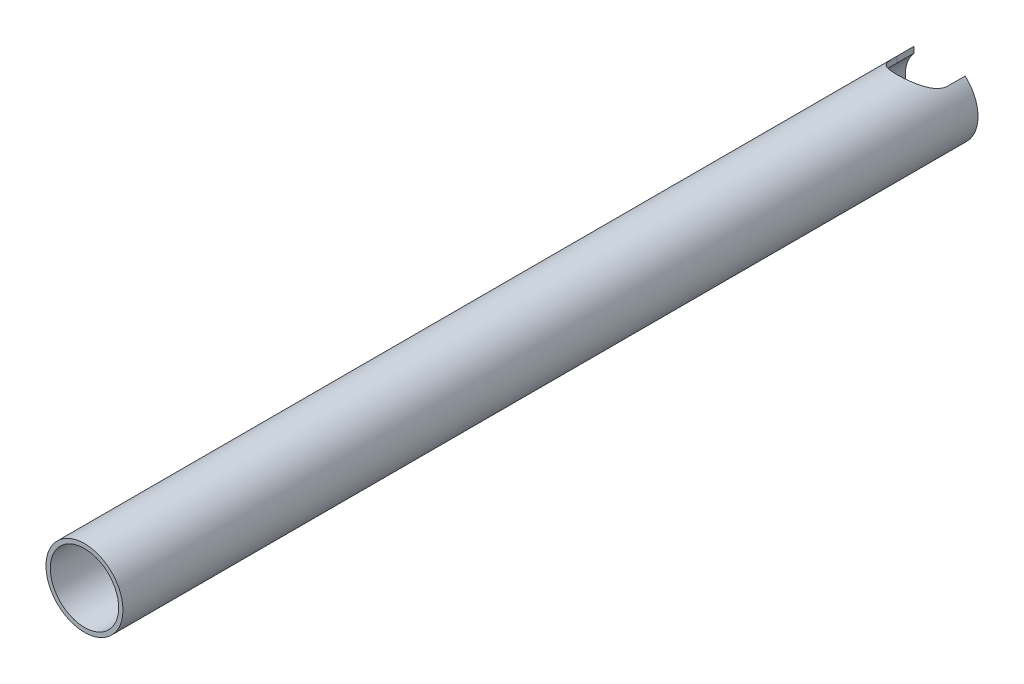
ISO-10303-21;
HEADER;
FILE_DESCRIPTION(('STEP AP214'),'2;1');
FILE_NAME('part.step','',(''),(''),'','','');
FILE_SCHEMA(('AUTOMOTIVE_DESIGN { 1 0 10303 214 1 1 1 1 }'));
ENDSEC;
DATA;
#1=APPLICATION_CONTEXT('core data for automotive mechanical design processes');
#2=APPLICATION_PROTOCOL_DEFINITION('international standard','automotive_design',2000,#1);
#3=PRODUCT_CONTEXT('',#1,'mechanical');
#4=PRODUCT('Part','Part','',(#3));
#5=PRODUCT_RELATED_PRODUCT_CATEGORY('part','',(#4));
#6=PRODUCT_DEFINITION_FORMATION('','',#4);
#7=PRODUCT_DEFINITION_CONTEXT('part definition',#1,'design');
#8=PRODUCT_DEFINITION('design','',#6,#7);
#9=PRODUCT_DEFINITION_SHAPE('','',#8);
#10=(LENGTH_UNIT() NAMED_UNIT(*) SI_UNIT(.MILLI.,.METRE.));
#11=(NAMED_UNIT(*) PLANE_ANGLE_UNIT() SI_UNIT($,.RADIAN.));
#12=(NAMED_UNIT(*) SI_UNIT($,.STERADIAN.) SOLID_ANGLE_UNIT());
#13=UNCERTAINTY_MEASURE_WITH_UNIT(LENGTH_MEASURE(1.E-05),#10,'distance_accuracy_value','');
#14=(GEOMETRIC_REPRESENTATION_CONTEXT(3) GLOBAL_UNCERTAINTY_ASSIGNED_CONTEXT((#13)) GLOBAL_UNIT_ASSIGNED_CONTEXT((#10,
#11,#12)) REPRESENTATION_CONTEXT('',''));
#15=CARTESIAN_POINT('',(0.,0.,0.));
#16=DIRECTION('',(0.,0.,1.));
#17=DIRECTION('',(1.,0.,0.));
#18=AXIS2_PLACEMENT_3D('',#15,#16,#17);
#19=CARTESIAN_POINT('',(0.,0.,-200.));
#20=DIRECTION('',(0.,0.,-1.));
#21=DIRECTION('',(1.,0.,0.));
#22=AXIS2_PLACEMENT_3D('',#19,#20,#21);
#23=PLANE('',#22);
#24=DIRECTION('',(0.,-1.,0.));
#25=VECTOR('',#24,1.);
#26=CARTESIAN_POINT('',(-6.,0.,-200.));
#27=LINE('',#26,#25);
#28=CARTESIAN_POINT('',(-6.,6.70820393249937,-200.));
#29=VERTEX_POINT('',#28);
#30=CARTESIAN_POINT('',(-6.,5.29150262212918,-200.));
#31=VERTEX_POINT('',#30);
#32=EDGE_CURVE('E106',#29,#31,#27,.T.);
#33=ORIENTED_EDGE('',*,*,#32,.T.);
#34=CARTESIAN_POINT('',(0.,0.,-200.));
#35=DIRECTION('',(0.,0.,1.));
#36=DIRECTION('',(1.,0.,0.));
#37=AXIS2_PLACEMENT_3D('',#34,#35,#36);
#38=CIRCLE('',#37,8.);
#39=CARTESIAN_POINT('',(6.,5.29150262212918,-200.));
#40=VERTEX_POINT('',#39);
#41=EDGE_CURVE('E165',#31,#40,#38,.T.);
#42=ORIENTED_EDGE('',*,*,#41,.T.);
#43=DIRECTION('',(0.,1.,0.));
#44=VECTOR('',#43,1.);
#45=CARTESIAN_POINT('',(6.,0.,-200.));
#46=LINE('',#45,#44);
#47=CARTESIAN_POINT('',(6.,6.70820393249937,-200.));
#48=VERTEX_POINT('',#47);
#49=EDGE_CURVE('E118',#40,#48,#46,.T.);
#50=ORIENTED_EDGE('',*,*,#49,.T.);
#51=CARTESIAN_POINT('',(0.,0.,-200.));
#52=DIRECTION('',(0.,0.,1.));
#53=DIRECTION('',(1.,0.,0.));
#54=AXIS2_PLACEMENT_3D('',#51,#52,#53);
#55=CIRCLE('',#54,9.);
#56=EDGE_CURVE('E111',#29,#48,#55,.T.);
#57=ORIENTED_EDGE('',*,*,#56,.F.);
#58=EDGE_LOOP('',(#33,#42,#50,#57));
#59=FACE_BOUND('',#58,.T.);
#60=ADVANCED_FACE('F43',(#59),#23,.T.);
#61=CARTESIAN_POINT('',(0.,0.,0.));
#62=DIRECTION('',(0.,0.,-1.));
#63=DIRECTION('',(1.,0.,0.));
#64=AXIS2_PLACEMENT_3D('',#61,#62,#63);
#65=PLANE('',#64);
#66=CARTESIAN_POINT('',(0.,0.,0.));
#67=DIRECTION('',(0.,0.,1.));
#68=DIRECTION('',(1.,0.,0.));
#69=AXIS2_PLACEMENT_3D('',#66,#67,#68);
#70=CIRCLE('',#69,9.);
#71=CARTESIAN_POINT('',(9.,0.,0.));
#72=VERTEX_POINT('',#71);
#73=EDGE_CURVE('E156',#72,#72,#70,.T.);
#74=ORIENTED_EDGE('',*,*,#73,.T.);
#75=EDGE_LOOP('',(#74));
#76=FACE_BOUND('',#75,.T.);
#77=CARTESIAN_POINT('',(0.,0.,0.));
#78=DIRECTION('',(0.,0.,1.));
#79=DIRECTION('',(1.,0.,0.));
#80=AXIS2_PLACEMENT_3D('',#77,#78,#79);
#81=CIRCLE('',#80,8.);
#82=CARTESIAN_POINT('',(8.,0.,0.));
#83=VERTEX_POINT('',#82);
#84=EDGE_CURVE('E163',#83,#83,#81,.T.);
#85=ORIENTED_EDGE('',*,*,#84,.F.);
#86=EDGE_LOOP('',(#85));
#87=FACE_BOUND('',#86,.T.);
#88=ADVANCED_FACE('F149',(#76,#87),#65,.F.);
#89=CARTESIAN_POINT('',(0.,0.,-200.));
#90=DIRECTION('',(0.,0.,1.));
#91=DIRECTION('',(-1.,0.,0.));
#92=AXIS2_PLACEMENT_3D('',#89,#90,#91);
#93=CYLINDRICAL_SURFACE('',#92,9.);
#94=ORIENTED_EDGE('',*,*,#56,.T.);
#95=DIRECTION('',(0.,0.,1.));
#96=VECTOR('',#95,1.);
#97=CARTESIAN_POINT('',(6.,6.70820393249937,-200.));
#98=LINE('',#97,#96);
#99=CARTESIAN_POINT('',(6.,6.70820393249937,-196.));
#100=VERTEX_POINT('',#99);
#101=EDGE_CURVE('E105',#100,#48,#98,.F.);
#102=ORIENTED_EDGE('',*,*,#101,.F.);
#103=CARTESIAN_POINT('',(-6.,6.70820393249937,-196.));
#104=CARTESIAN_POINT('',(-6.0000393183433,6.70812194573574,-195.852506980731));
#105=CARTESIAN_POINT('',(-5.99456347786238,6.71306593091113,-195.705061652411));
#106=CARTESIAN_POINT('',(-5.97289327726244,6.73237859024483,-195.411774037341));
#107=CARTESIAN_POINT('',(-5.95671328084198,6.74673463431257,-195.265929868277));
#108=CARTESIAN_POINT('',(-5.91415607609064,6.78406215747855,-194.978375981598));
#109=CARTESIAN_POINT('',(-5.88788106748825,6.8069472231382,-194.836639667377));
#110=CARTESIAN_POINT('',(-5.82560066996816,6.86032556958915,-194.556763780513));
#111=CARTESIAN_POINT('',(-5.78959245078331,6.89082106317695,-194.418625266884));
#112=CARTESIAN_POINT('',(-5.70858199668009,6.95807725230193,-194.147428771933));
#113=CARTESIAN_POINT('',(-5.66362787449207,6.994804284088,-194.014347963361));
#114=CARTESIAN_POINT('',(-5.56512538409717,7.07342589112545,-193.753028706149));
#115=CARTESIAN_POINT('',(-5.51157745308584,7.11532020347504,-193.624790011584));
#116=CARTESIAN_POINT('',(-5.33842689493356,7.24722356567827,-193.247177913208));
#117=CARTESIAN_POINT('',(-5.20649519991548,7.34329866853642,-193.005493595962));
#118=CARTESIAN_POINT('',(-4.88998497472128,7.55844009542074,-192.508915856898));
#119=CARTESIAN_POINT('',(-4.70042231706135,7.67876554502885,-192.257747766865));
#120=CARTESIAN_POINT('',(-4.38847297427156,7.85848610554915,-191.905379210826));
#121=CARTESIAN_POINT('',(-4.27982876675124,7.91829423228407,-191.791937198901));
#122=CARTESIAN_POINT('',(-4.05351803224065,8.03649599254022,-191.573519899));
#123=CARTESIAN_POINT('',(-3.93584941894303,8.09488929484438,-191.468546580438));
#124=CARTESIAN_POINT('',(-3.67410276883844,8.21734571815794,-191.25302928572));
#125=CARTESIAN_POINT('',(-3.52867128211092,8.28100042701004,-191.143890846029));
#126=CARTESIAN_POINT('',(-3.22705781179329,8.40312749208883,-190.938441866567));
#127=CARTESIAN_POINT('',(-3.07088087836644,8.46160225363382,-190.842125362347));
#128=CARTESIAN_POINT('',(-2.7485550368627,8.57172289580967,-190.663392008808));
#129=CARTESIAN_POINT('',(-2.58241066290611,8.62337184771766,-190.580968903514));
#130=CARTESIAN_POINT('',(-2.24117837103793,8.71828288420858,-190.431174670396));
#131=CARTESIAN_POINT('',(-2.06609237981828,8.76154676600818,-190.363800316619));
#132=CARTESIAN_POINT('',(-1.72849691899763,8.83395011628131,-190.251932590202));
#133=CARTESIAN_POINT('',(-1.56677951763714,8.8641295404735,-190.205720420075));
#134=CARTESIAN_POINT('',(-1.23871765597762,8.91589255205311,-190.126838317575));
#135=CARTESIAN_POINT('',(-1.0723735087317,8.93747671950317,-190.094167471343));
#136=CARTESIAN_POINT('',(-0.736763503715932,8.97137649057705,-190.042990402912));
#137=CARTESIAN_POINT('',(-0.567500918238733,8.98370186187713,-190.024469252972));
#138=CARTESIAN_POINT('',(-0.227596501670302,8.99872901097531,-190.001900549956));
#139=CARTESIAN_POINT('',(-0.056954868589227,9.00143214661064,-189.997850954732));
#140=CARTESIAN_POINT('',(0.257909828093748,8.99746462243315,-190.003803864367));
#141=CARTESIAN_POINT('',(0.40219455835203,8.99216016134809,-190.01175826242));
#142=CARTESIAN_POINT('',(0.689453317178941,8.97470670280735,-190.037998856573));
#143=CARTESIAN_POINT('',(0.832426917904149,8.96255554664857,-190.056288311231));
#144=CARTESIAN_POINT('',(1.11594062243916,8.93168553622766,-190.102940433048));
#145=CARTESIAN_POINT('',(1.25648156409055,8.91296899238517,-190.131299556643));
#146=CARTESIAN_POINT('',(1.53431926186213,8.86936580246273,-190.197735155283));
#147=CARTESIAN_POINT('',(1.67161473732113,8.84447676380638,-190.235815398588));
#148=CARTESIAN_POINT('',(1.94151594437167,8.78916401420626,-190.321051852994));
#149=CARTESIAN_POINT('',(2.07413974717568,8.75876529383256,-190.368167137181));
#150=CARTESIAN_POINT('',(2.33470201598792,8.69294276948524,-190.471092998353));
#151=CARTESIAN_POINT('',(2.46263881729357,8.65751720146291,-190.526906628487));
#152=CARTESIAN_POINT('',(2.83849835595443,8.5446597697204,-190.706612161669));
#153=CARTESIAN_POINT('',(3.07866953915028,8.46060488844629,-190.842832550333));
#154=CARTESIAN_POINT('',(3.56489228702402,8.26853604776286,-191.1639488568));
#155=CARTESIAN_POINT('',(3.80756841028923,8.15882511006946,-191.35288906415));
#156=CARTESIAN_POINT('',(4.25998331649615,7.93199864466213,-191.763721415403));
#157=CARTESIAN_POINT('',(4.46967121585829,7.81487206125219,-191.985663457895));
#158=CARTESIAN_POINT('',(4.77234020904544,7.63161953706803,-192.359155696051));
#159=CARTESIAN_POINT('',(4.8772295945531,7.56482963236636,-192.500887078842));
#160=CARTESIAN_POINT('',(5.07463232509068,7.43385178781524,-192.793857940915));
#161=CARTESIAN_POINT('',(5.16714277588728,7.36966445889255,-192.945099631629));
#162=CARTESIAN_POINT('',(5.424891961227,7.18436432971937,-193.412196144449));
#163=CARTESIAN_POINT('',(5.57088509041259,7.07017210785883,-193.742080318463));
#164=CARTESIAN_POINT('',(5.77061895485414,6.90737596649755,-194.336081892814));
#165=CARTESIAN_POINT('',(5.83874387569329,6.84936009029308,-194.592758129275));
#166=CARTESIAN_POINT('',(5.91517353662353,6.78319958018771,-194.985829861502));
#167=CARTESIAN_POINT('',(5.93634841066102,6.76463184262495,-195.118054286599));
#168=CARTESIAN_POINT('',(5.96984487292608,6.73509265405631,-195.384427253078));
#169=CARTESIAN_POINT('',(5.98217199357155,6.7241164562877,-195.518574538489));
#170=CARTESIAN_POINT('',(5.99330844907521,6.71418405629563,-195.71085756892));
#171=CARTESIAN_POINT('',(5.99581719087049,6.71194322091241,-195.768644375282));
#172=CARTESIAN_POINT('',(5.99916266713708,6.70895310557702,-195.884284727289));
#173=CARTESIAN_POINT('',(5.99999998296912,6.708203307008,-195.942138242723));
#174=CARTESIAN_POINT('',(6.,6.70820393249937,-196.));
#175=B_SPLINE_CURVE_WITH_KNOTS('',3,(#103,#104,#105,#106,#107,#108,#109,#110,#111,#112,#113,
#114,#115,#116,#117,#118,#119,#120,#121,#122,#123,#124,#125,#126,#127,#128,#129,#130,#131,#132,
#133,#134,#135,#136,#137,#138,#139,#140,#141,#142,#143,#144,#145,#146,#147,#148,#149,#150,#151,
#152,#153,#154,#155,#156,#157,#158,#159,#160,#161,#162,#163,#164,#165,#166,#167,#168,#169,#170,
#171,#172,#173,#174),.UNSPECIFIED.,.F.,.F.,(4,2,2,2,2,2,2,2,2,2,2,2,2,2,2,2,2,2,2,2,2,2,2,2,2,2,
2,2,2,2,2,2,2,2,2,4),(0.,0.442218902060999,0.883845599550486,1.32111440562802,1.75851049975334,
2.19361485357492,2.62869707920835,3.50073479655623,4.50746081603578,5.01131940006734,
5.5152948218338,6.09247253881144,6.66938082173012,7.2460286341691,7.82255271359904,
8.33441185130012,8.84623643963211,9.35752031133303,9.86873203059137,10.3020102889807,
10.7354252327199,11.1686878065584,11.6021185844215,12.0336305045627,12.4652942294365,
13.3279876664779,14.3040591784731,15.2816218010343,15.8466542882344,16.411818651815,
17.5394361699494,18.3513876988232,18.7565175336659,19.1613938233755,19.3350122681653,
19.5085703139019),.UNSPECIFIED.);
#176=CARTESIAN_POINT('',(-6.,6.70820393249937,-196.));
#177=VERTEX_POINT('',#176);
#178=EDGE_CURVE('E109',#177,#100,#175,.T.);
#179=ORIENTED_EDGE('',*,*,#178,.F.);
#180=DIRECTION('',(0.,0.,1.));
#181=VECTOR('',#180,1.);
#182=CARTESIAN_POINT('',(-6.,6.70820393249937,-200.));
#183=LINE('',#182,#181);
#184=EDGE_CURVE('E75',#29,#177,#183,.T.);
#185=ORIENTED_EDGE('',*,*,#184,.F.);
#186=EDGE_LOOP('',(#94,#102,#179,#185));
#187=FACE_BOUND('',#186,.T.);
#188=ORIENTED_EDGE('',*,*,#73,.F.);
#189=EDGE_LOOP('',(#188));
#190=FACE_BOUND('',#189,.T.);
#191=ADVANCED_FACE('F44',(#187,#190),#93,.T.);
#192=CARTESIAN_POINT('',(0.,0.,-200.));
#193=DIRECTION('',(0.,0.,1.));
#194=DIRECTION('',(-1.,0.,0.));
#195=AXIS2_PLACEMENT_3D('',#192,#193,#194);
#196=CYLINDRICAL_SURFACE('',#195,8.);
#197=DIRECTION('',(0.,0.,1.));
#198=VECTOR('',#197,1.);
#199=CARTESIAN_POINT('',(-6.,5.29150262212918,-200.));
#200=LINE('',#199,#198);
#201=CARTESIAN_POINT('',(-6.,5.29150262212918,-196.));
#202=VERTEX_POINT('',#201);
#203=EDGE_CURVE('E11',#31,#202,#200,.T.);
#204=ORIENTED_EDGE('',*,*,#203,.T.);
#205=CARTESIAN_POINT('',(-6.,5.29150262212918,-196.));
#206=CARTESIAN_POINT('',(-6.00000164734553,5.29149746130063,-195.929299215689));
#207=CARTESIAN_POINT('',(-5.99874992483121,5.29292042134915,-195.858612431604));
#208=CARTESIAN_POINT('',(-5.99375929848811,5.29857251101417,-195.717450627859));
#209=CARTESIAN_POINT('',(-5.99002081044604,5.30280117151782,-195.646975574775));
#210=CARTESIAN_POINT('',(-5.97512726223536,5.31959499598561,-195.436438424863));
#211=CARTESIAN_POINT('',(-5.96029391667244,5.33626847732026,-195.296930503187));
#212=CARTESIAN_POINT('',(-5.92146467708413,5.37931891935372,-195.02264831947));
#213=CARTESIAN_POINT('',(-5.89758872729309,5.40556869603609,-194.887836295229));
#214=CARTESIAN_POINT('',(-5.84118213277231,5.46647153069185,-194.621931044734));
#215=CARTESIAN_POINT('',(-5.80864733570754,5.50112861966951,-194.49083963616));
#216=CARTESIAN_POINT('',(-5.73578091551817,5.57705609976159,-194.234076022853));
#217=CARTESIAN_POINT('',(-5.69551468906141,5.61827055638512,-194.108368480834));
#218=CARTESIAN_POINT('',(-5.60752977965139,5.70609193113432,-193.861596067816));
#219=CARTESIAN_POINT('',(-5.55981184109297,5.7526983105091,-193.740530734582));
#220=CARTESIAN_POINT('',(-5.40571853410941,5.89900121175978,-193.383599325024));
#221=CARTESIAN_POINT('',(-5.28863395224688,6.00493049059014,-193.154793376452));
#222=CARTESIAN_POINT('',(-5.08003235744934,6.18093054783945,-192.803606798809));
#223=CARTESIAN_POINT('',(-4.99673902321449,6.24859868310512,-192.674948483868));
#224=CARTESIAN_POINT('',(-4.82093036772026,6.38521973153118,-192.424807481964));
#225=CARTESIAN_POINT('',(-4.72841432126793,6.45417274537597,-192.303325360472));
#226=CARTESIAN_POINT('',(-4.43720798879207,6.66090963382174,-191.949759541453));
#227=CARTESIAN_POINT('',(-4.22484445848777,6.79858453976931,-191.728531124821));
#228=CARTESIAN_POINT('',(-3.85677854448346,7.01077089521444,-191.400035472149));
#229=CARTESIAN_POINT('',(-3.71206447027489,7.08865432832994,-191.282400060903));
#230=CARTESIAN_POINT('',(-3.41024785229984,7.23868552108811,-191.05982239082));
#231=CARTESIAN_POINT('',(-3.25314252757324,7.31083198584902,-190.954882994809));
#232=CARTESIAN_POINT('',(-2.92748738140682,7.44721036286365,-190.759213349274));
#233=CARTESIAN_POINT('',(-2.75895787294117,7.5114557793649,-190.668458781422));
#234=CARTESIAN_POINT('',(-2.41119946943849,7.6301911953997,-190.502438157635));
#235=CARTESIAN_POINT('',(-2.2319763013099,7.68468635517768,-190.427163905697));
#236=CARTESIAN_POINT('',(-1.91981544570525,7.76736517405681,-190.313791142147));
#237=CARTESIAN_POINT('',(-1.78923137620704,7.79852622386618,-190.271328994596));
#238=CARTESIAN_POINT('',(-1.52422909700309,7.85461977621466,-190.195198861307));
#239=CARTESIAN_POINT('',(-1.3898118140051,7.87955377020367,-190.161528769686));
#240=CARTESIAN_POINT('',(-1.1180230429965,7.92268544907432,-190.103448250311));
#241=CARTESIAN_POINT('',(-0.980653655025508,7.94088776510486,-190.079031456338));
#242=CARTESIAN_POINT('',(-0.703792112495761,7.9701977558813,-190.03977994756));
#243=CARTESIAN_POINT('',(-0.564299882018418,7.9813051762812,-190.024945576277));
#244=CARTESIAN_POINT('',(-0.283857320899895,7.99619868039414,-190.005065723171));
#245=CARTESIAN_POINT('',(-0.142904119696008,7.99996542591576,-190.000046097089));
#246=CARTESIAN_POINT('',(0.139006716824936,8.00003409940456,-189.999954535817));
#247=CARTESIAN_POINT('',(0.279964352122297,7.99633605683647,-190.004882561363));
#248=CARTESIAN_POINT('',(0.56082213053902,7.98155736180775,-190.024608757108));
#249=CARTESIAN_POINT('',(0.700722059237648,7.97047525097633,-190.03940887707));
#250=CARTESIAN_POINT('',(0.978397724164498,7.94117321022885,-190.07864865745));
#251=CARTESIAN_POINT('',(1.11617347450189,7.92295332774438,-190.103088253812));
#252=CARTESIAN_POINT('',(1.3839551510545,7.88050768014737,-190.160243554479));
#253=CARTESIAN_POINT('',(1.51406502760778,7.85651130758527,-190.192643953359));
#254=CARTESIAN_POINT('',(1.77072992844799,7.8026752011739,-190.265687098327));
#255=CARTESIAN_POINT('',(1.89728371438224,7.7728334599092,-190.306332676143));
#256=CARTESIAN_POINT('',(2.27058720904833,7.67531280863459,-190.439948434221));
#257=CARTESIAN_POINT('',(2.51116863882605,7.59960732816932,-190.544638930134));
#258=CARTESIAN_POINT('',(2.9969153602917,7.42243473030987,-190.794130794891));
#259=CARTESIAN_POINT('',(3.23975440607125,7.31906538668208,-190.942048607236));
#260=CARTESIAN_POINT('',(3.69829736350047,7.09840449015697,-191.266963816457));
#261=CARTESIAN_POINT('',(3.91398034333128,6.98110233158908,-191.443983405509));
#262=CARTESIAN_POINT('',(4.23583596963117,6.78804083470792,-191.747338267198));
#263=CARTESIAN_POINT('',(4.35122114890484,6.71450091073725,-191.865505604413));
#264=CARTESIAN_POINT('',(4.57160313183084,6.56643304982319,-192.110579711394));
#265=CARTESIAN_POINT('',(4.67660176414746,6.49190528942867,-192.237484936064));
#266=CARTESIAN_POINT('',(4.87611364252768,6.34342206895683,-192.499896498755));
#267=CARTESIAN_POINT('',(4.97061341127991,6.26946745530601,-192.635413548974));
#268=CARTESIAN_POINT('',(5.14865041086736,6.12409941254336,-192.914741514764));
#269=CARTESIAN_POINT('',(5.23219013690457,6.05268540773531,-193.058550531787));
#270=CARTESIAN_POINT('',(5.37254365577724,5.92813404110711,-193.325338733702));
#271=CARTESIAN_POINT('',(5.43138438442486,5.87416125485588,-193.446863733178));
#272=CARTESIAN_POINT('',(5.5413408736172,5.77055000888551,-193.695225150725));
#273=CARTESIAN_POINT('',(5.59245427231992,5.72091287629918,-193.822063177644));
#274=CARTESIAN_POINT('',(5.68625012211941,5.62769176245618,-194.08027559041));
#275=CARTESIAN_POINT('',(5.72896954127146,5.58408150227078,-194.211626948687));
#276=CARTESIAN_POINT('',(5.80567365362211,5.5042910727892,-194.478991477923));
#277=CARTESIAN_POINT('',(5.83966483280454,5.46810539030669,-194.615001101627));
#278=CARTESIAN_POINT('',(5.89031205286352,5.41342854550062,-194.853374139022));
#279=CARTESIAN_POINT('',(5.90916723672386,5.39280369759212,-194.954785604311));
#280=CARTESIAN_POINT('',(5.94171986779775,5.35691605972682,-195.159352566744));
#281=CARTESIAN_POINT('',(5.95541890485186,5.34165161704606,-195.262507516037));
#282=CARTESIAN_POINT('',(5.97755949694622,5.31686736002835,-195.470990602493));
#283=CARTESIAN_POINT('',(5.98595443847325,5.30739850056437,-195.57632982725));
#284=CARTESIAN_POINT('',(5.99718514551604,5.29469401011652,-195.787772528299));
#285=CARTESIAN_POINT('',(6.00001580245987,5.2914641071683,-195.893876617216));
#286=CARTESIAN_POINT('',(6.,5.29150262212919,-196.));
#287=B_SPLINE_CURVE_WITH_KNOTS('',3,(#205,#206,#207,#208,#209,#210,#211,#212,#213,#214,#215,
#216,#217,#218,#219,#220,#221,#222,#223,#224,#225,#226,#227,#228,#229,#230,#231,#232,#233,#234,
#235,#236,#237,#238,#239,#240,#241,#242,#243,#244,#245,#246,#247,#248,#249,#250,#251,#252,#253,
#254,#255,#256,#257,#258,#259,#260,#261,#262,#263,#264,#265,#266,#267,#268,#269,#270,#271,#272,
#273,#274,#275,#276,#277,#278,#279,#280,#281,#282,#283,#284,#285,#286),.UNSPECIFIED.,.F.,.F.,(4,
2,2,2,2,2,2,2,2,2,2,2,2,2,2,2,2,2,2,2,2,2,2,2,2,2,2,2,2,2,2,2,2,2,2,2,2,2,2,2,4),(0.,
0.212049935582529,0.42406442536758,0.847096983047166,1.26470438079724,1.68251240342031,
2.09693077200734,2.51130776838553,3.34263552478065,3.84490978127099,4.34722356338937,
5.35175523229734,5.957376761797,6.56313459941825,7.16784226315849,7.7722289374483,
8.19422783459786,8.61612556112341,9.03773249507414,9.45935454242826,9.88208581267284,
10.3048154143323,10.7276285308357,11.1504388377281,11.5586328901709,11.9669673710899,
12.7830530944666,13.6875367840661,14.5927134337423,15.1346425174526,15.6764760182129,
16.2189972201063,16.7613946945816,17.1972953536469,17.6333289766275,18.0673969560296,
18.5011414384825,18.8164661754747,19.1316936057844,19.4496541383768,19.7679064545729),.UNSPECIFIED.);
#288=CARTESIAN_POINT('',(6.,5.29150262212918,-196.));
#289=VERTEX_POINT('',#288);
#290=EDGE_CURVE('E52',#202,#289,#287,.T.);
#291=ORIENTED_EDGE('',*,*,#290,.T.);
#292=DIRECTION('',(0.,0.,1.));
#293=VECTOR('',#292,1.);
#294=CARTESIAN_POINT('',(6.,5.29150262212918,-200.));
#295=LINE('',#294,#293);
#296=EDGE_CURVE('E104',#289,#40,#295,.F.);
#297=ORIENTED_EDGE('',*,*,#296,.T.);
#298=ORIENTED_EDGE('',*,*,#41,.F.);
#299=EDGE_LOOP('',(#204,#291,#297,#298));
#300=FACE_BOUND('',#299,.T.);
#301=ORIENTED_EDGE('',*,*,#84,.T.);
#302=EDGE_LOOP('',(#301));
#303=FACE_BOUND('',#302,.T.);
#304=ADVANCED_FACE('F145',(#300,#303),#196,.F.);
#305=CARTESIAN_POINT('',(-6.,0.,-204.));
#306=DIRECTION('',(-1.,0.,0.));
#307=DIRECTION('',(0.,0.,-1.));
#308=AXIS2_PLACEMENT_3D('',#305,#306,#307);
#309=PLANE('',#308);
#310=ORIENTED_EDGE('',*,*,#32,.F.);
#311=ORIENTED_EDGE('',*,*,#184,.T.);
#312=DIRECTION('',(0.,1.,0.));
#313=VECTOR('',#312,1.);
#314=CARTESIAN_POINT('',(-6.,0.,-196.));
#315=LINE('',#314,#313);
#316=EDGE_CURVE('E103',#202,#177,#315,.T.);
#317=ORIENTED_EDGE('',*,*,#316,.F.);
#318=ORIENTED_EDGE('',*,*,#203,.F.);
#319=EDGE_LOOP('',(#310,#311,#317,#318));
#320=FACE_BOUND('',#319,.T.);
#321=ADVANCED_FACE('F135',(#320),#309,.F.);
#322=CARTESIAN_POINT('',(0.,0.,-196.));
#323=DIRECTION('',(0.,1.,0.));
#324=DIRECTION('',(0.,0.,-1.));
#325=AXIS2_PLACEMENT_3D('',#322,#323,#324);
#326=CYLINDRICAL_SURFACE('',#325,6.);
#327=ORIENTED_EDGE('',*,*,#316,.T.);
#328=ORIENTED_EDGE('',*,*,#178,.T.);
#329=DIRECTION('',(0.,1.,0.));
#330=VECTOR('',#329,1.);
#331=CARTESIAN_POINT('',(6.,0.,-196.));
#332=LINE('',#331,#330);
#333=EDGE_CURVE('E65',#289,#100,#332,.T.);
#334=ORIENTED_EDGE('',*,*,#333,.F.);
#335=ORIENTED_EDGE('',*,*,#290,.F.);
#336=EDGE_LOOP('',(#327,#328,#334,#335));
#337=FACE_BOUND('',#336,.T.);
#338=ADVANCED_FACE('F107',(#337),#326,.F.);
#339=CARTESIAN_POINT('',(6.,0.,-204.));
#340=DIRECTION('',(1.,0.,0.));
#341=DIRECTION('',(0.,0.,1.));
#342=AXIS2_PLACEMENT_3D('',#339,#340,#341);
#343=PLANE('',#342);
#344=ORIENTED_EDGE('',*,*,#333,.T.);
#345=ORIENTED_EDGE('',*,*,#101,.T.);
#346=ORIENTED_EDGE('',*,*,#49,.F.);
#347=ORIENTED_EDGE('',*,*,#296,.F.);
#348=EDGE_LOOP('',(#344,#345,#346,#347));
#349=FACE_BOUND('',#348,.T.);
#350=ADVANCED_FACE('F98',(#349),#343,.F.);
#351=CLOSED_SHELL('',(#60,#88,#191,#304,#321,#338,#350));
#352=MANIFOLD_SOLID_BREP('B2',#351);
#353=ADVANCED_BREP_SHAPE_REPRESENTATION('',(#18,#352),#14);
#354=SHAPE_DEFINITION_REPRESENTATION(#9,#353);
ENDSEC;
END-ISO-10303-21;
